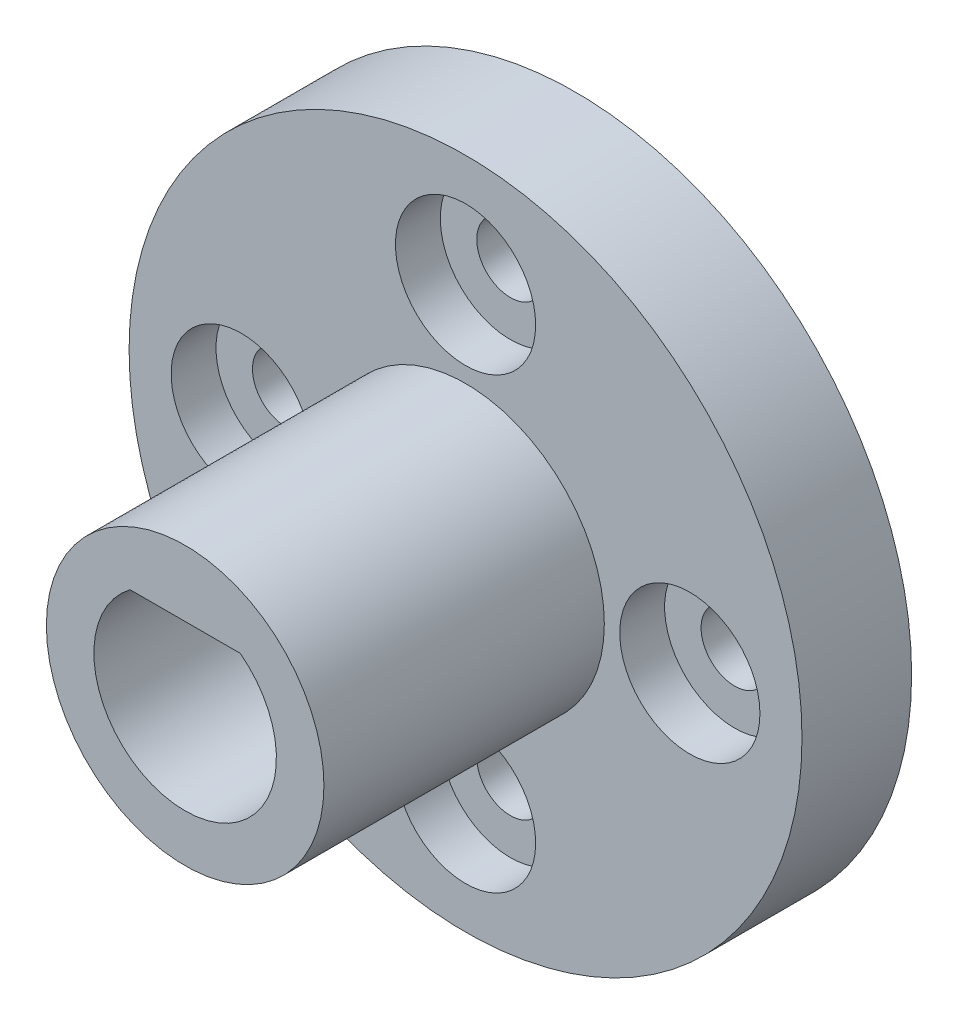
ISO-10303-21;
HEADER;
FILE_DESCRIPTION(('STEP AP214'),'2;1');
FILE_NAME('part.step','',(''),(''),'','','');
FILE_SCHEMA(('AUTOMOTIVE_DESIGN { 1 0 10303 214 1 1 1 1 }'));
ENDSEC;
DATA;
#1=APPLICATION_CONTEXT('core data for automotive mechanical design processes');
#2=APPLICATION_PROTOCOL_DEFINITION('international standard','automotive_design',2000,#1);
#3=PRODUCT_CONTEXT('',#1,'mechanical');
#4=PRODUCT('Part','Part','',(#3));
#5=PRODUCT_RELATED_PRODUCT_CATEGORY('part','',(#4));
#6=PRODUCT_DEFINITION_FORMATION('','',#4);
#7=PRODUCT_DEFINITION_CONTEXT('part definition',#1,'design');
#8=PRODUCT_DEFINITION('design','',#6,#7);
#9=PRODUCT_DEFINITION_SHAPE('','',#8);
#10=(LENGTH_UNIT() NAMED_UNIT(*) SI_UNIT(.MILLI.,.METRE.));
#11=(NAMED_UNIT(*) PLANE_ANGLE_UNIT() SI_UNIT($,.RADIAN.));
#12=(NAMED_UNIT(*) SI_UNIT($,.STERADIAN.) SOLID_ANGLE_UNIT());
#13=UNCERTAINTY_MEASURE_WITH_UNIT(LENGTH_MEASURE(1.E-05),#10,'distance_accuracy_value','');
#14=(GEOMETRIC_REPRESENTATION_CONTEXT(3) GLOBAL_UNCERTAINTY_ASSIGNED_CONTEXT((#13)) GLOBAL_UNIT_ASSIGNED_CONTEXT((#10,
#11,#12)) REPRESENTATION_CONTEXT('',''));
#15=CARTESIAN_POINT('',(0.,0.,0.));
#16=DIRECTION('',(0.,0.,1.));
#17=DIRECTION('',(1.,0.,0.));
#18=AXIS2_PLACEMENT_3D('',#15,#16,#17);
#19=CARTESIAN_POINT('',(0.,0.,3.91));
#20=DIRECTION('',(0.,0.,-1.));
#21=DIRECTION('',(-1.,0.,0.));
#22=AXIS2_PLACEMENT_3D('',#19,#20,#21);
#23=CYLINDRICAL_SURFACE('',#22,12.);
#24=CARTESIAN_POINT('',(0.,0.,3.91));
#25=DIRECTION('',(0.,0.,1.));
#26=DIRECTION('',(1.,0.,0.));
#27=AXIS2_PLACEMENT_3D('',#24,#25,#26);
#28=CIRCLE('',#27,12.);
#29=CARTESIAN_POINT('',(12.,0.,3.91));
#30=VERTEX_POINT('',#29);
#31=EDGE_CURVE('E11',#30,#30,#28,.T.);
#32=ORIENTED_EDGE('',*,*,#31,.F.);
#33=EDGE_LOOP('',(#32));
#34=FACE_BOUND('',#33,.T.);
#35=CARTESIAN_POINT('',(0.,0.,0.));
#36=DIRECTION('',(0.,0.,1.));
#37=DIRECTION('',(1.,0.,0.));
#38=AXIS2_PLACEMENT_3D('',#35,#36,#37);
#39=CIRCLE('',#38,12.);
#40=CARTESIAN_POINT('',(12.,0.,0.));
#41=VERTEX_POINT('',#40);
#42=EDGE_CURVE('E40',#41,#41,#39,.T.);
#43=ORIENTED_EDGE('',*,*,#42,.T.);
#44=EDGE_LOOP('',(#43));
#45=FACE_BOUND('',#44,.T.);
#46=ADVANCED_FACE('F37',(#34,#45),#23,.T.);
#47=CARTESIAN_POINT('',(0.,0.,3.91));
#48=DIRECTION('',(0.,0.,1.));
#49=DIRECTION('',(1.,0.,0.));
#50=AXIS2_PLACEMENT_3D('',#47,#48,#49);
#51=PLANE('',#50);
#52=CARTESIAN_POINT('',(8.,0.,3.91));
#53=DIRECTION('',(0.,0.,1.));
#54=DIRECTION('',(1.,0.,0.));
#55=AXIS2_PLACEMENT_3D('',#52,#53,#54);
#56=CIRCLE('',#55,2.5);
#57=CARTESIAN_POINT('',(10.5,0.,3.91));
#58=VERTEX_POINT('',#57);
#59=EDGE_CURVE('E307',#58,#58,#56,.T.);
#60=ORIENTED_EDGE('',*,*,#59,.F.);
#61=EDGE_LOOP('',(#60));
#62=FACE_BOUND('',#61,.T.);
#63=CARTESIAN_POINT('',(0.,-8.,3.91));
#64=DIRECTION('',(0.,0.,1.));
#65=DIRECTION('',(1.,0.,0.));
#66=AXIS2_PLACEMENT_3D('',#63,#64,#65);
#67=CIRCLE('',#66,2.5);
#68=CARTESIAN_POINT('',(2.5,-8.,3.91));
#69=VERTEX_POINT('',#68);
#70=EDGE_CURVE('E317',#69,#69,#67,.T.);
#71=ORIENTED_EDGE('',*,*,#70,.F.);
#72=EDGE_LOOP('',(#71));
#73=FACE_BOUND('',#72,.T.);
#74=CARTESIAN_POINT('',(-8.,0.,3.91));
#75=DIRECTION('',(0.,0.,1.));
#76=DIRECTION('',(1.,0.,0.));
#77=AXIS2_PLACEMENT_3D('',#74,#75,#76);
#78=CIRCLE('',#77,2.5);
#79=CARTESIAN_POINT('',(-5.50000000000001,0.,3.91));
#80=VERTEX_POINT('',#79);
#81=EDGE_CURVE('E329',#80,#80,#78,.T.);
#82=ORIENTED_EDGE('',*,*,#81,.F.);
#83=EDGE_LOOP('',(#82));
#84=FACE_BOUND('',#83,.T.);
#85=CARTESIAN_POINT('',(0.,8.,3.91));
#86=DIRECTION('',(0.,0.,1.));
#87=DIRECTION('',(1.,0.,0.));
#88=AXIS2_PLACEMENT_3D('',#85,#86,#87);
#89=CIRCLE('',#88,2.5);
#90=CARTESIAN_POINT('',(2.5,8.,3.91));
#91=VERTEX_POINT('',#90);
#92=EDGE_CURVE('E341',#91,#91,#89,.T.);
#93=ORIENTED_EDGE('',*,*,#92,.F.);
#94=EDGE_LOOP('',(#93));
#95=FACE_BOUND('',#94,.T.);
#96=CARTESIAN_POINT('',(0.,0.,3.91));
#97=DIRECTION('',(0.,0.,1.));
#98=DIRECTION('',(1.,0.,0.));
#99=AXIS2_PLACEMENT_3D('',#96,#97,#98);
#100=CIRCLE('',#99,4.95);
#101=CARTESIAN_POINT('',(4.95,0.,3.91));
#102=VERTEX_POINT('',#101);
#103=EDGE_CURVE('E77',#102,#102,#100,.T.);
#104=ORIENTED_EDGE('',*,*,#103,.F.);
#105=EDGE_LOOP('',(#104));
#106=FACE_BOUND('',#105,.T.);
#107=ORIENTED_EDGE('',*,*,#31,.T.);
#108=EDGE_LOOP('',(#107));
#109=FACE_BOUND('',#108,.T.);
#110=ADVANCED_FACE('F96',(#62,#73,#84,#95,#106,#109),#51,.T.);
#111=CARTESIAN_POINT('',(0.,0.,0.));
#112=DIRECTION('',(0.,0.,1.));
#113=DIRECTION('',(1.,0.,0.));
#114=AXIS2_PLACEMENT_3D('',#111,#112,#113);
#115=PLANE('',#114);
#116=CARTESIAN_POINT('',(8.,0.,0.));
#117=DIRECTION('',(0.,0.,1.));
#118=DIRECTION('',(1.,0.,0.));
#119=AXIS2_PLACEMENT_3D('',#116,#117,#118);
#120=CIRCLE('',#119,1.2);
#121=CARTESIAN_POINT('',(9.2,0.,0.));
#122=VERTEX_POINT('',#121);
#123=EDGE_CURVE('E314',#122,#122,#120,.T.);
#124=ORIENTED_EDGE('',*,*,#123,.T.);
#125=EDGE_LOOP('',(#124));
#126=FACE_BOUND('',#125,.T.);
#127=CARTESIAN_POINT('',(0.,-8.,0.));
#128=DIRECTION('',(0.,0.,1.));
#129=DIRECTION('',(1.,0.,0.));
#130=AXIS2_PLACEMENT_3D('',#127,#128,#129);
#131=CIRCLE('',#130,1.2);
#132=CARTESIAN_POINT('',(1.2,-8.,0.));
#133=VERTEX_POINT('',#132);
#134=EDGE_CURVE('E326',#133,#133,#131,.T.);
#135=ORIENTED_EDGE('',*,*,#134,.T.);
#136=EDGE_LOOP('',(#135));
#137=FACE_BOUND('',#136,.T.);
#138=CARTESIAN_POINT('',(-8.,0.,0.));
#139=DIRECTION('',(0.,0.,1.));
#140=DIRECTION('',(1.,0.,0.));
#141=AXIS2_PLACEMENT_3D('',#138,#139,#140);
#142=CIRCLE('',#141,1.2);
#143=CARTESIAN_POINT('',(-6.8,0.,0.));
#144=VERTEX_POINT('',#143);
#145=EDGE_CURVE('E338',#144,#144,#142,.T.);
#146=ORIENTED_EDGE('',*,*,#145,.T.);
#147=EDGE_LOOP('',(#146));
#148=FACE_BOUND('',#147,.T.);
#149=CARTESIAN_POINT('',(0.,8.,0.));
#150=DIRECTION('',(0.,0.,1.));
#151=DIRECTION('',(1.,0.,0.));
#152=AXIS2_PLACEMENT_3D('',#149,#150,#151);
#153=CIRCLE('',#152,1.2);
#154=CARTESIAN_POINT('',(1.2,8.,0.));
#155=VERTEX_POINT('',#154);
#156=EDGE_CURVE('E67',#155,#155,#153,.T.);
#157=ORIENTED_EDGE('',*,*,#156,.T.);
#158=EDGE_LOOP('',(#157));
#159=FACE_BOUND('',#158,.T.);
#160=CARTESIAN_POINT('',(0.,0.,0.));
#161=DIRECTION('',(0.,0.,-1.));
#162=DIRECTION('',(-1.,0.,0.));
#163=AXIS2_PLACEMENT_3D('',#160,#161,#162);
#164=CIRCLE('',#163,4.15);
#165=CARTESIAN_POINT('',(-4.15,0.,0.));
#166=VERTEX_POINT('',#165);
#167=EDGE_CURVE('E84',#166,#166,#164,.T.);
#168=ORIENTED_EDGE('',*,*,#167,.F.);
#169=EDGE_LOOP('',(#168));
#170=FACE_BOUND('',#169,.T.);
#171=ORIENTED_EDGE('',*,*,#42,.F.);
#172=EDGE_LOOP('',(#171));
#173=FACE_BOUND('',#172,.T.);
#174=ADVANCED_FACE('F93',(#126,#137,#148,#159,#170,#173),#115,.F.);
#175=CARTESIAN_POINT('',(0.,0.,1.91));
#176=DIRECTION('',(0.,0.,-1.));
#177=DIRECTION('',(-1.,0.,0.));
#178=AXIS2_PLACEMENT_3D('',#175,#176,#177);
#179=CYLINDRICAL_SURFACE('',#178,4.15);
#180=CARTESIAN_POINT('',(0.,0.,1.91));
#181=DIRECTION('',(0.,0.,-1.));
#182=DIRECTION('',(-1.,0.,0.));
#183=AXIS2_PLACEMENT_3D('',#180,#181,#182);
#184=CIRCLE('',#183,4.15);
#185=CARTESIAN_POINT('',(-4.15,0.,1.91));
#186=VERTEX_POINT('',#185);
#187=EDGE_CURVE('E85',#186,#186,#184,.T.);
#188=CARTESIAN_POINT('',(-4.15,0.,1.91));
#189=CARTESIAN_POINT('',(-4.15,0.,1.89010416666667));
#190=CARTESIAN_POINT('',(-4.15,0.,1.87020833333333));
#191=CARTESIAN_POINT('',(-4.15,0.,1.83041666666667));
#192=CARTESIAN_POINT('',(-4.15,0.,1.81052083333333));
#193=CARTESIAN_POINT('',(-4.15,0.,1.77072916666667));
#194=CARTESIAN_POINT('',(-4.15,0.,1.75083333333333));
#195=CARTESIAN_POINT('',(-4.15,0.,1.71104166666667));
#196=CARTESIAN_POINT('',(-4.15,0.,1.69114583333333));
#197=CARTESIAN_POINT('',(-4.15,0.,1.65135416666667));
#198=CARTESIAN_POINT('',(-4.15,0.,1.63145833333333));
#199=CARTESIAN_POINT('',(-4.15,0.,1.59166666666667));
#200=CARTESIAN_POINT('',(-4.15,0.,1.57177083333333));
#201=CARTESIAN_POINT('',(-4.15,0.,1.53197916666667));
#202=CARTESIAN_POINT('',(-4.15,0.,1.51208333333333));
#203=CARTESIAN_POINT('',(-4.15,0.,1.47229166666667));
#204=CARTESIAN_POINT('',(-4.15,0.,1.45239583333333));
#205=CARTESIAN_POINT('',(-4.15,0.,1.41260416666667));
#206=CARTESIAN_POINT('',(-4.15,0.,1.39270833333333));
#207=CARTESIAN_POINT('',(-4.15,0.,1.35291666666667));
#208=CARTESIAN_POINT('',(-4.15,0.,1.33302083333333));
#209=CARTESIAN_POINT('',(-4.15,0.,1.29322916666667));
#210=CARTESIAN_POINT('',(-4.15,0.,1.27333333333333));
#211=CARTESIAN_POINT('',(-4.15,0.,1.23354166666667));
#212=CARTESIAN_POINT('',(-4.15,0.,1.21364583333333));
#213=CARTESIAN_POINT('',(-4.15,0.,1.17385416666667));
#214=CARTESIAN_POINT('',(-4.15,0.,1.15395833333333));
#215=CARTESIAN_POINT('',(-4.15,0.,1.11416666666667));
#216=CARTESIAN_POINT('',(-4.15,0.,1.09427083333333));
#217=CARTESIAN_POINT('',(-4.15,0.,1.05447916666667));
#218=CARTESIAN_POINT('',(-4.15,0.,1.03458333333333));
#219=CARTESIAN_POINT('',(-4.15,0.,0.994791666666667));
#220=CARTESIAN_POINT('',(-4.15,0.,0.974895833333334));
#221=CARTESIAN_POINT('',(-4.15,0.,0.935104166666667));
#222=CARTESIAN_POINT('',(-4.15,0.,0.915208333333333));
#223=CARTESIAN_POINT('',(-4.15,0.,0.875416666666667));
#224=CARTESIAN_POINT('',(-4.15,0.,0.855520833333333));
#225=CARTESIAN_POINT('',(-4.15,0.,0.815729166666667));
#226=CARTESIAN_POINT('',(-4.15,0.,0.795833333333333));
#227=CARTESIAN_POINT('',(-4.15,0.,0.756041666666667));
#228=CARTESIAN_POINT('',(-4.15,0.,0.736145833333333));
#229=CARTESIAN_POINT('',(-4.15,0.,0.696354166666667));
#230=CARTESIAN_POINT('',(-4.15,0.,0.676458333333333));
#231=CARTESIAN_POINT('',(-4.15,0.,0.636666666666667));
#232=CARTESIAN_POINT('',(-4.15,0.,0.616770833333333));
#233=CARTESIAN_POINT('',(-4.15,0.,0.576979166666667));
#234=CARTESIAN_POINT('',(-4.15,0.,0.557083333333333));
#235=CARTESIAN_POINT('',(-4.15,0.,0.517291666666667));
#236=CARTESIAN_POINT('',(-4.15,0.,0.497395833333333));
#237=CARTESIAN_POINT('',(-4.15,0.,0.457604166666667));
#238=CARTESIAN_POINT('',(-4.15,0.,0.437708333333333));
#239=CARTESIAN_POINT('',(-4.15,0.,0.397916666666667));
#240=CARTESIAN_POINT('',(-4.15,0.,0.378020833333333));
#241=CARTESIAN_POINT('',(-4.15,0.,0.338229166666667));
#242=CARTESIAN_POINT('',(-4.15,0.,0.318333333333333));
#243=CARTESIAN_POINT('',(-4.15,0.,0.278541666666667));
#244=CARTESIAN_POINT('',(-4.15,0.,0.258645833333333));
#245=CARTESIAN_POINT('',(-4.15,0.,0.218854166666667));
#246=CARTESIAN_POINT('',(-4.15,0.,0.198958333333333));
#247=CARTESIAN_POINT('',(-4.15,0.,0.159166666666667));
#248=CARTESIAN_POINT('',(-4.15,0.,0.139270833333333));
#249=CARTESIAN_POINT('',(-4.15,0.,0.0994791666666668));
#250=CARTESIAN_POINT('',(-4.15,0.,0.0795833333333334));
#251=CARTESIAN_POINT('',(-4.15,0.,0.0397916666666667));
#252=CARTESIAN_POINT('',(-4.15,0.,0.0198958333333334));
#253=CARTESIAN_POINT('',(-4.15,0.,0.));
#254=B_SPLINE_CURVE_WITH_KNOTS('',3,(#188,#189,#190,#191,#192,#193,#194,#195,#196,#197,#198,
#199,#200,#201,#202,#203,#204,#205,#206,#207,#208,#209,#210,#211,#212,#213,#214,#215,#216,#217,
#218,#219,#220,#221,#222,#223,#224,#225,#226,#227,#228,#229,#230,#231,#232,#233,#234,#235,#236,
#237,#238,#239,#240,#241,#242,#243,#244,#245,#246,#247,#248,#249,#250,#251,#252,#253),
.UNSPECIFIED.,.F.,.F.,(4,2,2,2,2,2,2,2,2,2,2,2,2,2,2,2,2,2,2,2,2,2,2,2,2,2,2,2,2,2,2,2,4),(0.,
0.0596874999999998,0.119375,0.1790625,0.23875,0.2984375,0.358125,0.4178125,0.4775,0.5371875,
0.596875,0.6565625,0.71625,0.7759375,0.835625,0.8953125,0.955,1.0146875,1.074375,1.1340625,
1.19375,1.2534375,1.313125,1.3728125,1.4325,1.4921875,1.551875,1.6115625,1.67125,1.7309375,
1.790625,1.8503125,1.91),.UNSPECIFIED.);
#255=EDGE_CURVE('BSEAM91',#186,#166,#254,.T.);
#256=ORIENTED_EDGE('',*,*,#187,.F.);
#257=ORIENTED_EDGE('',*,*,#167,.T.);
#258=ORIENTED_EDGE('',*,*,#255,.T.);
#259=ORIENTED_EDGE('',*,*,#255,.F.);
#260=EDGE_LOOP('',(#256,#258,#257,#259));
#261=FACE_BOUND('',#260,.T.);
#262=ADVANCED_FACE('F91',(#261),#179,.F.);
#263=CARTESIAN_POINT('',(0.,0.,1.91));
#264=DIRECTION('',(0.,0.,-1.));
#265=DIRECTION('',(-1.,0.,0.));
#266=AXIS2_PLACEMENT_3D('',#263,#264,#265);
#267=PLANE('',#266);
#268=ORIENTED_EDGE('',*,*,#187,.T.);
#269=EDGE_LOOP('',(#268));
#270=FACE_BOUND('',#269,.T.);
#271=ADVANCED_FACE('F140',(#270),#267,.T.);
#272=CARTESIAN_POINT('',(0.,2.595,13.91));
#273=DIRECTION('',(0.,-1.,0.));
#274=DIRECTION('',(0.,0.,-1.));
#275=AXIS2_PLACEMENT_3D('',#272,#273,#274);
#276=PLANE('',#275);
#277=DIRECTION('',(-1.,0.,0.));
#278=VECTOR('',#277,1.);
#279=CARTESIAN_POINT('',(0.,2.595,3.91));
#280=LINE('',#279,#278);
#281=CARTESIAN_POINT('',(1.96494274725754,2.595,3.91));
#282=VERTEX_POINT('',#281);
#283=CARTESIAN_POINT('',(-1.96494274725754,2.595,3.91));
#284=VERTEX_POINT('',#283);
#285=EDGE_CURVE('E64',#282,#284,#280,.T.);
#286=ORIENTED_EDGE('',*,*,#285,.F.);
#287=DIRECTION('',(0.,0.,-1.));
#288=VECTOR('',#287,1.);
#289=CARTESIAN_POINT('',(1.96494274725754,2.595,13.91));
#290=LINE('',#289,#288);
#291=CARTESIAN_POINT('',(1.96494274725754,2.595,13.91));
#292=VERTEX_POINT('',#291);
#293=EDGE_CURVE('E73',#292,#282,#290,.T.);
#294=ORIENTED_EDGE('',*,*,#293,.F.);
#295=DIRECTION('',(-1.,0.,0.));
#296=VECTOR('',#295,1.);
#297=CARTESIAN_POINT('',(0.,2.595,13.91));
#298=LINE('',#297,#296);
#299=CARTESIAN_POINT('',(-1.96494274725754,2.595,13.91));
#300=VERTEX_POINT('',#299);
#301=EDGE_CURVE('E71',#292,#300,#298,.T.);
#302=ORIENTED_EDGE('',*,*,#301,.T.);
#303=DIRECTION('',(0.,0.,-1.));
#304=VECTOR('',#303,1.);
#305=CARTESIAN_POINT('',(-1.96494274725754,2.595,13.91));
#306=LINE('',#305,#304);
#307=EDGE_CURVE('E58',#300,#284,#306,.T.);
#308=ORIENTED_EDGE('',*,*,#307,.T.);
#309=EDGE_LOOP('',(#286,#294,#302,#308));
#310=FACE_BOUND('',#309,.T.);
#311=ADVANCED_FACE('F69',(#310),#276,.T.);
#312=CARTESIAN_POINT('',(0.,0.,13.91));
#313=DIRECTION('',(0.,0.,-1.));
#314=DIRECTION('',(-1.,0.,0.));
#315=AXIS2_PLACEMENT_3D('',#312,#313,#314);
#316=CYLINDRICAL_SURFACE('',#315,3.255);
#317=CARTESIAN_POINT('',(0.,0.,3.91));
#318=DIRECTION('',(0.,0.,1.));
#319=DIRECTION('',(1.,0.,0.));
#320=AXIS2_PLACEMENT_3D('',#317,#318,#319);
#321=CIRCLE('',#320,3.255);
#322=EDGE_CURVE('E50',#284,#282,#321,.T.);
#323=ORIENTED_EDGE('',*,*,#322,.F.);
#324=ORIENTED_EDGE('',*,*,#307,.F.);
#325=CARTESIAN_POINT('',(0.,0.,13.91));
#326=DIRECTION('',(0.,0.,1.));
#327=DIRECTION('',(1.,0.,0.));
#328=AXIS2_PLACEMENT_3D('',#325,#326,#327);
#329=CIRCLE('',#328,3.255);
#330=EDGE_CURVE('E353',#300,#292,#329,.T.);
#331=ORIENTED_EDGE('',*,*,#330,.T.);
#332=ORIENTED_EDGE('',*,*,#293,.T.);
#333=EDGE_LOOP('',(#323,#324,#331,#332));
#334=FACE_BOUND('',#333,.T.);
#335=ADVANCED_FACE('F76',(#334),#316,.F.);
#336=CARTESIAN_POINT('',(0.,0.,13.91));
#337=DIRECTION('',(0.,0.,-1.));
#338=DIRECTION('',(-1.,0.,0.));
#339=AXIS2_PLACEMENT_3D('',#336,#337,#338);
#340=CYLINDRICAL_SURFACE('',#339,4.95);
#341=CARTESIAN_POINT('',(0.,0.,13.91));
#342=DIRECTION('',(0.,0.,1.));
#343=DIRECTION('',(1.,0.,0.));
#344=AXIS2_PLACEMENT_3D('',#341,#342,#343);
#345=CIRCLE('',#344,4.95);
#346=CARTESIAN_POINT('',(4.95,0.,13.91));
#347=VERTEX_POINT('',#346);
#348=EDGE_CURVE('E74',#347,#347,#345,.T.);
#349=ORIENTED_EDGE('',*,*,#348,.F.);
#350=EDGE_LOOP('',(#349));
#351=FACE_BOUND('',#350,.T.);
#352=ORIENTED_EDGE('',*,*,#103,.T.);
#353=EDGE_LOOP('',(#352));
#354=FACE_BOUND('',#353,.T.);
#355=ADVANCED_FACE('F125',(#351,#354),#340,.T.);
#356=CARTESIAN_POINT('',(0.,0.,13.91));
#357=DIRECTION('',(0.,0.,1.));
#358=DIRECTION('',(1.,0.,0.));
#359=AXIS2_PLACEMENT_3D('',#356,#357,#358);
#360=PLANE('',#359);
#361=ORIENTED_EDGE('',*,*,#301,.F.);
#362=ORIENTED_EDGE('',*,*,#330,.F.);
#363=EDGE_LOOP('',(#361,#362));
#364=FACE_BOUND('',#363,.T.);
#365=ORIENTED_EDGE('',*,*,#348,.T.);
#366=EDGE_LOOP('',(#365));
#367=FACE_BOUND('',#366,.T.);
#368=ADVANCED_FACE('F117',(#364,#367),#360,.T.);
#369=ORIENTED_EDGE('',*,*,#285,.T.);
#370=ORIENTED_EDGE('',*,*,#322,.T.);
#371=EDGE_LOOP('',(#369,#370));
#372=FACE_BOUND('',#371,.T.);
#373=ADVANCED_FACE('F65',(#372),#51,.T.);
#374=CARTESIAN_POINT('',(0.,8.,3.91));
#375=DIRECTION('',(0.,0.,1.));
#376=DIRECTION('',(1.,0.,0.));
#377=AXIS2_PLACEMENT_3D('',#374,#375,#376);
#378=CYLINDRICAL_SURFACE('',#377,1.2);
#379=ORIENTED_EDGE('',*,*,#156,.F.);
#380=EDGE_LOOP('',(#379));
#381=FACE_BOUND('',#380,.T.);
#382=CARTESIAN_POINT('',(0.,8.,2.31));
#383=DIRECTION('',(0.,0.,1.));
#384=DIRECTION('',(1.,0.,0.));
#385=AXIS2_PLACEMENT_3D('',#382,#383,#384);
#386=CIRCLE('',#385,1.2);
#387=CARTESIAN_POINT('',(1.2,8.,2.31));
#388=VERTEX_POINT('',#387);
#389=EDGE_CURVE('E347',#388,#388,#386,.T.);
#390=ORIENTED_EDGE('',*,*,#389,.T.);
#391=EDGE_LOOP('',(#390));
#392=FACE_BOUND('',#391,.T.);
#393=ADVANCED_FACE('F116',(#381,#392),#378,.F.);
#394=CARTESIAN_POINT('',(1.2,8.,2.31));
#395=DIRECTION('',(0.,0.,-1.));
#396=DIRECTION('',(-1.,0.,0.));
#397=AXIS2_PLACEMENT_3D('',#394,#395,#396);
#398=PLANE('',#397);
#399=ORIENTED_EDGE('',*,*,#389,.F.);
#400=EDGE_LOOP('',(#399));
#401=FACE_BOUND('',#400,.T.);
#402=CARTESIAN_POINT('',(0.,8.,2.31));
#403=DIRECTION('',(0.,0.,1.));
#404=DIRECTION('',(1.,0.,0.));
#405=AXIS2_PLACEMENT_3D('',#402,#403,#404);
#406=CIRCLE('',#405,2.5);
#407=CARTESIAN_POINT('',(2.5,8.,2.31));
#408=VERTEX_POINT('',#407);
#409=EDGE_CURVE('E344',#408,#408,#406,.T.);
#410=ORIENTED_EDGE('',*,*,#409,.T.);
#411=EDGE_LOOP('',(#410));
#412=FACE_BOUND('',#411,.T.);
#413=ADVANCED_FACE('F122',(#401,#412),#398,.F.);
#414=CARTESIAN_POINT('',(0.,8.,3.91));
#415=DIRECTION('',(0.,0.,1.));
#416=DIRECTION('',(1.,0.,0.));
#417=AXIS2_PLACEMENT_3D('',#414,#415,#416);
#418=CYLINDRICAL_SURFACE('',#417,2.5);
#419=ORIENTED_EDGE('',*,*,#409,.F.);
#420=EDGE_LOOP('',(#419));
#421=FACE_BOUND('',#420,.T.);
#422=ORIENTED_EDGE('',*,*,#92,.T.);
#423=EDGE_LOOP('',(#422));
#424=FACE_BOUND('',#423,.T.);
#425=ADVANCED_FACE('F190',(#421,#424),#418,.F.);
#426=CARTESIAN_POINT('',(-8.,0.,3.91));
#427=DIRECTION('',(0.,0.,1.));
#428=DIRECTION('',(1.,0.,0.));
#429=AXIS2_PLACEMENT_3D('',#426,#427,#428);
#430=CYLINDRICAL_SURFACE('',#429,1.2);
#431=ORIENTED_EDGE('',*,*,#145,.F.);
#432=EDGE_LOOP('',(#431));
#433=FACE_BOUND('',#432,.T.);
#434=CARTESIAN_POINT('',(-8.,0.,2.31));
#435=DIRECTION('',(0.,0.,1.));
#436=DIRECTION('',(1.,0.,0.));
#437=AXIS2_PLACEMENT_3D('',#434,#435,#436);
#438=CIRCLE('',#437,1.2);
#439=CARTESIAN_POINT('',(-6.8,0.,2.31));
#440=VERTEX_POINT('',#439);
#441=EDGE_CURVE('E335',#440,#440,#438,.T.);
#442=ORIENTED_EDGE('',*,*,#441,.T.);
#443=EDGE_LOOP('',(#442));
#444=FACE_BOUND('',#443,.T.);
#445=ADVANCED_FACE('F198',(#433,#444),#430,.F.);
#446=CARTESIAN_POINT('',(-6.8,0.,2.31));
#447=DIRECTION('',(0.,0.,-1.));
#448=DIRECTION('',(-1.,0.,0.));
#449=AXIS2_PLACEMENT_3D('',#446,#447,#448);
#450=PLANE('',#449);
#451=ORIENTED_EDGE('',*,*,#441,.F.);
#452=EDGE_LOOP('',(#451));
#453=FACE_BOUND('',#452,.T.);
#454=CARTESIAN_POINT('',(-8.,0.,2.31));
#455=DIRECTION('',(0.,0.,1.));
#456=DIRECTION('',(1.,0.,0.));
#457=AXIS2_PLACEMENT_3D('',#454,#455,#456);
#458=CIRCLE('',#457,2.5);
#459=CARTESIAN_POINT('',(-5.5,0.,2.31));
#460=VERTEX_POINT('',#459);
#461=EDGE_CURVE('E332',#460,#460,#458,.T.);
#462=ORIENTED_EDGE('',*,*,#461,.T.);
#463=EDGE_LOOP('',(#462));
#464=FACE_BOUND('',#463,.T.);
#465=ADVANCED_FACE('F218',(#453,#464),#450,.F.);
#466=CARTESIAN_POINT('',(-8.,0.,3.91));
#467=DIRECTION('',(0.,0.,1.));
#468=DIRECTION('',(1.,0.,0.));
#469=AXIS2_PLACEMENT_3D('',#466,#467,#468);
#470=CYLINDRICAL_SURFACE('',#469,2.5);
#471=ORIENTED_EDGE('',*,*,#461,.F.);
#472=EDGE_LOOP('',(#471));
#473=FACE_BOUND('',#472,.T.);
#474=ORIENTED_EDGE('',*,*,#81,.T.);
#475=EDGE_LOOP('',(#474));
#476=FACE_BOUND('',#475,.T.);
#477=ADVANCED_FACE('F228',(#473,#476),#470,.F.);
#478=CARTESIAN_POINT('',(0.,-8.,3.91));
#479=DIRECTION('',(0.,0.,1.));
#480=DIRECTION('',(1.,0.,0.));
#481=AXIS2_PLACEMENT_3D('',#478,#479,#480);
#482=CYLINDRICAL_SURFACE('',#481,1.2);
#483=ORIENTED_EDGE('',*,*,#134,.F.);
#484=EDGE_LOOP('',(#483));
#485=FACE_BOUND('',#484,.T.);
#486=CARTESIAN_POINT('',(0.,-8.,2.31));
#487=DIRECTION('',(0.,0.,1.));
#488=DIRECTION('',(1.,0.,0.));
#489=AXIS2_PLACEMENT_3D('',#486,#487,#488);
#490=CIRCLE('',#489,1.2);
#491=CARTESIAN_POINT('',(1.2,-8.,2.31));
#492=VERTEX_POINT('',#491);
#493=EDGE_CURVE('E323',#492,#492,#490,.T.);
#494=ORIENTED_EDGE('',*,*,#493,.T.);
#495=EDGE_LOOP('',(#494));
#496=FACE_BOUND('',#495,.T.);
#497=ADVANCED_FACE('F238',(#485,#496),#482,.F.);
#498=CARTESIAN_POINT('',(1.2,-8.,2.31));
#499=DIRECTION('',(0.,0.,-1.));
#500=DIRECTION('',(-1.,0.,0.));
#501=AXIS2_PLACEMENT_3D('',#498,#499,#500);
#502=PLANE('',#501);
#503=ORIENTED_EDGE('',*,*,#493,.F.);
#504=EDGE_LOOP('',(#503));
#505=FACE_BOUND('',#504,.T.);
#506=CARTESIAN_POINT('',(0.,-8.,2.31));
#507=DIRECTION('',(0.,0.,1.));
#508=DIRECTION('',(1.,0.,0.));
#509=AXIS2_PLACEMENT_3D('',#506,#507,#508);
#510=CIRCLE('',#509,2.5);
#511=CARTESIAN_POINT('',(2.5,-8.,2.31));
#512=VERTEX_POINT('',#511);
#513=EDGE_CURVE('E320',#512,#512,#510,.T.);
#514=ORIENTED_EDGE('',*,*,#513,.T.);
#515=EDGE_LOOP('',(#514));
#516=FACE_BOUND('',#515,.T.);
#517=ADVANCED_FACE('F248',(#505,#516),#502,.F.);
#518=CARTESIAN_POINT('',(0.,-8.,3.91));
#519=DIRECTION('',(0.,0.,1.));
#520=DIRECTION('',(1.,0.,0.));
#521=AXIS2_PLACEMENT_3D('',#518,#519,#520);
#522=CYLINDRICAL_SURFACE('',#521,2.5);
#523=ORIENTED_EDGE('',*,*,#513,.F.);
#524=EDGE_LOOP('',(#523));
#525=FACE_BOUND('',#524,.T.);
#526=ORIENTED_EDGE('',*,*,#70,.T.);
#527=EDGE_LOOP('',(#526));
#528=FACE_BOUND('',#527,.T.);
#529=ADVANCED_FACE('F258',(#525,#528),#522,.F.);
#530=CARTESIAN_POINT('',(8.,0.,3.91));
#531=DIRECTION('',(0.,0.,1.));
#532=DIRECTION('',(1.,0.,0.));
#533=AXIS2_PLACEMENT_3D('',#530,#531,#532);
#534=CYLINDRICAL_SURFACE('',#533,1.2);
#535=ORIENTED_EDGE('',*,*,#123,.F.);
#536=EDGE_LOOP('',(#535));
#537=FACE_BOUND('',#536,.T.);
#538=CARTESIAN_POINT('',(8.,0.,2.31));
#539=DIRECTION('',(0.,0.,1.));
#540=DIRECTION('',(1.,0.,0.));
#541=AXIS2_PLACEMENT_3D('',#538,#539,#540);
#542=CIRCLE('',#541,1.2);
#543=CARTESIAN_POINT('',(9.2,0.,2.31));
#544=VERTEX_POINT('',#543);
#545=EDGE_CURVE('E309',#544,#544,#542,.T.);
#546=ORIENTED_EDGE('',*,*,#545,.T.);
#547=EDGE_LOOP('',(#546));
#548=FACE_BOUND('',#547,.T.);
#549=ADVANCED_FACE('F268',(#537,#548),#534,.F.);
#550=CARTESIAN_POINT('',(9.2,0.,2.31));
#551=DIRECTION('',(0.,0.,-1.));
#552=DIRECTION('',(-1.,0.,0.));
#553=AXIS2_PLACEMENT_3D('',#550,#551,#552);
#554=PLANE('',#553);
#555=ORIENTED_EDGE('',*,*,#545,.F.);
#556=EDGE_LOOP('',(#555));
#557=FACE_BOUND('',#556,.T.);
#558=CARTESIAN_POINT('',(8.,0.,2.31));
#559=DIRECTION('',(0.,0.,1.));
#560=DIRECTION('',(1.,0.,0.));
#561=AXIS2_PLACEMENT_3D('',#558,#559,#560);
#562=CIRCLE('',#561,2.5);
#563=CARTESIAN_POINT('',(10.5,0.,2.31));
#564=VERTEX_POINT('',#563);
#565=EDGE_CURVE('E305',#564,#564,#562,.T.);
#566=ORIENTED_EDGE('',*,*,#565,.T.);
#567=EDGE_LOOP('',(#566));
#568=FACE_BOUND('',#567,.T.);
#569=ADVANCED_FACE('F278',(#557,#568),#554,.F.);
#570=CARTESIAN_POINT('',(8.,0.,3.91));
#571=DIRECTION('',(0.,0.,1.));
#572=DIRECTION('',(1.,0.,0.));
#573=AXIS2_PLACEMENT_3D('',#570,#571,#572);
#574=CYLINDRICAL_SURFACE('',#573,2.5);
#575=ORIENTED_EDGE('',*,*,#565,.F.);
#576=EDGE_LOOP('',(#575));
#577=FACE_BOUND('',#576,.T.);
#578=ORIENTED_EDGE('',*,*,#59,.T.);
#579=EDGE_LOOP('',(#578));
#580=FACE_BOUND('',#579,.T.);
#581=ADVANCED_FACE('F288',(#577,#580),#574,.F.);
#582=CLOSED_SHELL('',(#46,#110,#174,#262,#271,#311,#335,#355,#368,#373,#393,#413,#425,#445,#465,
#477,#497,#517,#529,#549,#569,#581));
#583=MANIFOLD_SOLID_BREP('B2',#582);
#584=ADVANCED_BREP_SHAPE_REPRESENTATION('',(#18,#583),#14);
#585=SHAPE_DEFINITION_REPRESENTATION(#9,#584);
ENDSEC;
END-ISO-10303-21;
